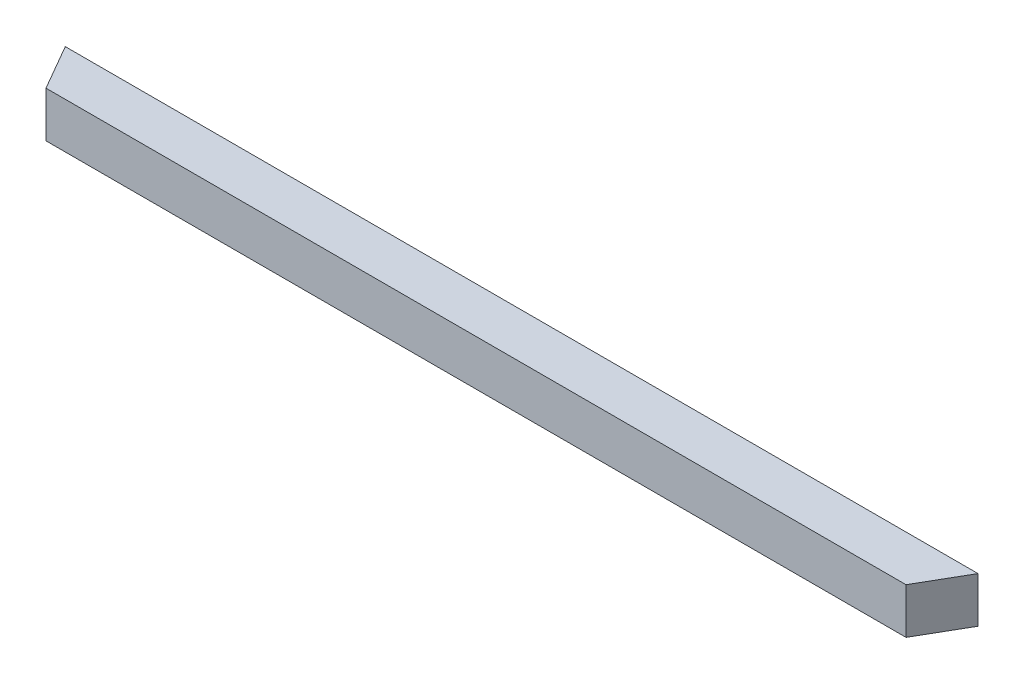
ISO-10303-21;
HEADER;
FILE_DESCRIPTION(('STEP AP214'),'2;1');
FILE_NAME('part.step','',(''),(''),'','','');
FILE_SCHEMA(('AUTOMOTIVE_DESIGN { 1 0 10303 214 1 1 1 1 }'));
ENDSEC;
DATA;
#1=APPLICATION_CONTEXT('core data for automotive mechanical design processes');
#2=APPLICATION_PROTOCOL_DEFINITION('international standard','automotive_design',2000,#1);
#3=PRODUCT_CONTEXT('',#1,'mechanical');
#4=PRODUCT('Part','Part','',(#3));
#5=PRODUCT_RELATED_PRODUCT_CATEGORY('part','',(#4));
#6=PRODUCT_DEFINITION_FORMATION('','',#4);
#7=PRODUCT_DEFINITION_CONTEXT('part definition',#1,'design');
#8=PRODUCT_DEFINITION('design','',#6,#7);
#9=PRODUCT_DEFINITION_SHAPE('','',#8);
#10=(LENGTH_UNIT() NAMED_UNIT(*) SI_UNIT(.MILLI.,.METRE.));
#11=(NAMED_UNIT(*) PLANE_ANGLE_UNIT() SI_UNIT($,.RADIAN.));
#12=(NAMED_UNIT(*) SI_UNIT($,.STERADIAN.) SOLID_ANGLE_UNIT());
#13=UNCERTAINTY_MEASURE_WITH_UNIT(LENGTH_MEASURE(1.E-05),#10,'distance_accuracy_value','');
#14=(GEOMETRIC_REPRESENTATION_CONTEXT(3) GLOBAL_UNCERTAINTY_ASSIGNED_CONTEXT((#13)) GLOBAL_UNIT_ASSIGNED_CONTEXT((#10,
#11,#12)) REPRESENTATION_CONTEXT('',''));
#15=CARTESIAN_POINT('',(0.,0.,0.));
#16=DIRECTION('',(0.,0.,1.));
#17=DIRECTION('',(1.,0.,0.));
#18=AXIS2_PLACEMENT_3D('',#15,#16,#17);
#19=CARTESIAN_POINT('',(188.452994616208,20.,20.));
#20=DIRECTION('',(-0.86602540378444,0.,-0.499999999999997));
#21=DIRECTION('',(-0.499999999999997,0.,0.86602540378444));
#22=AXIS2_PLACEMENT_3D('',#19,#20,#21);
#23=PLANE('',#22);
#24=DIRECTION('',(0.499999999999997,0.,-0.86602540378444));
#25=VECTOR('',#24,1.);
#26=CARTESIAN_POINT('',(188.452994616208,0.,20.));
#27=LINE('',#26,#25);
#28=CARTESIAN_POINT('',(188.452994616208,0.,20.));
#29=VERTEX_POINT('',#28);
#30=CARTESIAN_POINT('',(200.,0.,0.));
#31=VERTEX_POINT('',#30);
#32=EDGE_CURVE('E96',#29,#31,#27,.T.);
#33=ORIENTED_EDGE('',*,*,#32,.T.);
#34=DIRECTION('',(0.,-1.,0.));
#35=VECTOR('',#34,1.);
#36=CARTESIAN_POINT('',(200.,20.,0.));
#37=LINE('',#36,#35);
#38=CARTESIAN_POINT('',(200.,20.,0.));
#39=VERTEX_POINT('',#38);
#40=EDGE_CURVE('E11',#39,#31,#37,.T.);
#41=ORIENTED_EDGE('',*,*,#40,.F.);
#42=DIRECTION('',(0.499999999999997,0.,-0.86602540378444));
#43=VECTOR('',#42,1.);
#44=CARTESIAN_POINT('',(188.452994616208,20.,20.));
#45=LINE('',#44,#43);
#46=CARTESIAN_POINT('',(188.452994616208,20.,20.));
#47=VERTEX_POINT('',#46);
#48=EDGE_CURVE('E84',#47,#39,#45,.T.);
#49=ORIENTED_EDGE('',*,*,#48,.F.);
#50=DIRECTION('',(0.,-1.,0.));
#51=VECTOR('',#50,1.);
#52=CARTESIAN_POINT('',(188.452994616208,20.,20.));
#53=LINE('',#52,#51);
#54=EDGE_CURVE('E92',#47,#29,#53,.T.);
#55=ORIENTED_EDGE('',*,*,#54,.T.);
#56=EDGE_LOOP('',(#33,#41,#49,#55));
#57=FACE_BOUND('',#56,.T.);
#58=ADVANCED_FACE('F33',(#57),#23,.F.);
#59=CARTESIAN_POINT('',(-200.,20.,0.));
#60=DIRECTION('',(0.,0.,1.));
#61=DIRECTION('',(1.,0.,0.));
#62=AXIS2_PLACEMENT_3D('',#59,#60,#61);
#63=PLANE('',#62);
#64=DIRECTION('',(-1.,0.,0.));
#65=VECTOR('',#64,1.);
#66=CARTESIAN_POINT('',(-200.,0.,0.));
#67=LINE('',#66,#65);
#68=CARTESIAN_POINT('',(-200.,0.,0.));
#69=VERTEX_POINT('',#68);
#70=EDGE_CURVE('E88',#31,#69,#67,.T.);
#71=ORIENTED_EDGE('',*,*,#70,.T.);
#72=DIRECTION('',(0.,-1.,0.));
#73=VECTOR('',#72,1.);
#74=CARTESIAN_POINT('',(-200.,20.,0.));
#75=LINE('',#74,#73);
#76=CARTESIAN_POINT('',(-200.,20.,0.));
#77=VERTEX_POINT('',#76);
#78=EDGE_CURVE('E41',#77,#69,#75,.T.);
#79=ORIENTED_EDGE('',*,*,#78,.F.);
#80=DIRECTION('',(-1.,0.,0.));
#81=VECTOR('',#80,1.);
#82=CARTESIAN_POINT('',(-200.,20.,0.));
#83=LINE('',#82,#81);
#84=EDGE_CURVE('E79',#39,#77,#83,.T.);
#85=ORIENTED_EDGE('',*,*,#84,.F.);
#86=ORIENTED_EDGE('',*,*,#40,.T.);
#87=EDGE_LOOP('',(#71,#79,#85,#86));
#88=FACE_BOUND('',#87,.T.);
#89=ADVANCED_FACE('F87',(#88),#63,.F.);
#90=CARTESIAN_POINT('',(-200.,20.,0.));
#91=DIRECTION('',(0.86602540378444,0.,-0.499999999999998));
#92=DIRECTION('',(-0.499999999999998,0.,-0.86602540378444));
#93=AXIS2_PLACEMENT_3D('',#90,#91,#92);
#94=PLANE('',#93);
#95=DIRECTION('',(0.499999999999998,0.,0.86602540378444));
#96=VECTOR('',#95,1.);
#97=CARTESIAN_POINT('',(-200.,0.,0.));
#98=LINE('',#97,#96);
#99=CARTESIAN_POINT('',(-188.452994616208,0.,20.));
#100=VERTEX_POINT('',#99);
#101=EDGE_CURVE('E66',#69,#100,#98,.T.);
#102=ORIENTED_EDGE('',*,*,#101,.T.);
#103=DIRECTION('',(0.,-1.,0.));
#104=VECTOR('',#103,1.);
#105=CARTESIAN_POINT('',(-188.452994616208,20.,20.));
#106=LINE('',#105,#104);
#107=CARTESIAN_POINT('',(-188.452994616208,20.,20.));
#108=VERTEX_POINT('',#107);
#109=EDGE_CURVE('E89',#108,#100,#106,.T.);
#110=ORIENTED_EDGE('',*,*,#109,.F.);
#111=DIRECTION('',(0.499999999999998,0.,0.86602540378444));
#112=VECTOR('',#111,1.);
#113=CARTESIAN_POINT('',(-200.,20.,0.));
#114=LINE('',#113,#112);
#115=EDGE_CURVE('E82',#77,#108,#114,.T.);
#116=ORIENTED_EDGE('',*,*,#115,.F.);
#117=ORIENTED_EDGE('',*,*,#78,.T.);
#118=EDGE_LOOP('',(#102,#110,#116,#117));
#119=FACE_BOUND('',#118,.T.);
#120=ADVANCED_FACE('F90',(#119),#94,.F.);
#121=CARTESIAN_POINT('',(-188.452994616208,20.,20.));
#122=DIRECTION('',(0.,0.,-1.));
#123=DIRECTION('',(-1.,0.,0.));
#124=AXIS2_PLACEMENT_3D('',#121,#122,#123);
#125=PLANE('',#124);
#126=DIRECTION('',(1.,0.,0.));
#127=VECTOR('',#126,1.);
#128=CARTESIAN_POINT('',(-188.452994616208,0.,20.));
#129=LINE('',#128,#127);
#130=EDGE_CURVE('E72',#100,#29,#129,.T.);
#131=ORIENTED_EDGE('',*,*,#130,.T.);
#132=ORIENTED_EDGE('',*,*,#54,.F.);
#133=DIRECTION('',(1.,0.,0.));
#134=VECTOR('',#133,1.);
#135=CARTESIAN_POINT('',(-188.452994616208,20.,20.));
#136=LINE('',#135,#134);
#137=EDGE_CURVE('E49',#108,#47,#136,.T.);
#138=ORIENTED_EDGE('',*,*,#137,.F.);
#139=ORIENTED_EDGE('',*,*,#109,.T.);
#140=EDGE_LOOP('',(#131,#132,#138,#139));
#141=FACE_BOUND('',#140,.T.);
#142=ADVANCED_FACE('F103',(#141),#125,.F.);
#143=CARTESIAN_POINT('',(0.,20.,0.));
#144=DIRECTION('',(0.,-1.,0.));
#145=DIRECTION('',(0.,0.,-1.));
#146=AXIS2_PLACEMENT_3D('',#143,#144,#145);
#147=PLANE('',#146);
#148=ORIENTED_EDGE('',*,*,#48,.T.);
#149=ORIENTED_EDGE('',*,*,#84,.T.);
#150=ORIENTED_EDGE('',*,*,#115,.T.);
#151=ORIENTED_EDGE('',*,*,#137,.T.);
#152=EDGE_LOOP('',(#148,#149,#150,#151));
#153=FACE_BOUND('',#152,.T.);
#154=ADVANCED_FACE('F80',(#153),#147,.F.);
#155=CARTESIAN_POINT('',(0.,0.,0.));
#156=DIRECTION('',(0.,-1.,0.));
#157=DIRECTION('',(0.,0.,-1.));
#158=AXIS2_PLACEMENT_3D('',#155,#156,#157);
#159=PLANE('',#158);
#160=ORIENTED_EDGE('',*,*,#32,.F.);
#161=ORIENTED_EDGE('',*,*,#130,.F.);
#162=ORIENTED_EDGE('',*,*,#101,.F.);
#163=ORIENTED_EDGE('',*,*,#70,.F.);
#164=EDGE_LOOP('',(#160,#161,#162,#163));
#165=FACE_BOUND('',#164,.T.);
#166=ADVANCED_FACE('F106',(#165),#159,.T.);
#167=CLOSED_SHELL('',(#58,#89,#120,#142,#154,#166));
#168=MANIFOLD_SOLID_BREP('B2',#167);
#169=ADVANCED_BREP_SHAPE_REPRESENTATION('',(#18,#168),#14);
#170=SHAPE_DEFINITION_REPRESENTATION(#9,#169);
ENDSEC;
END-ISO-10303-21;
